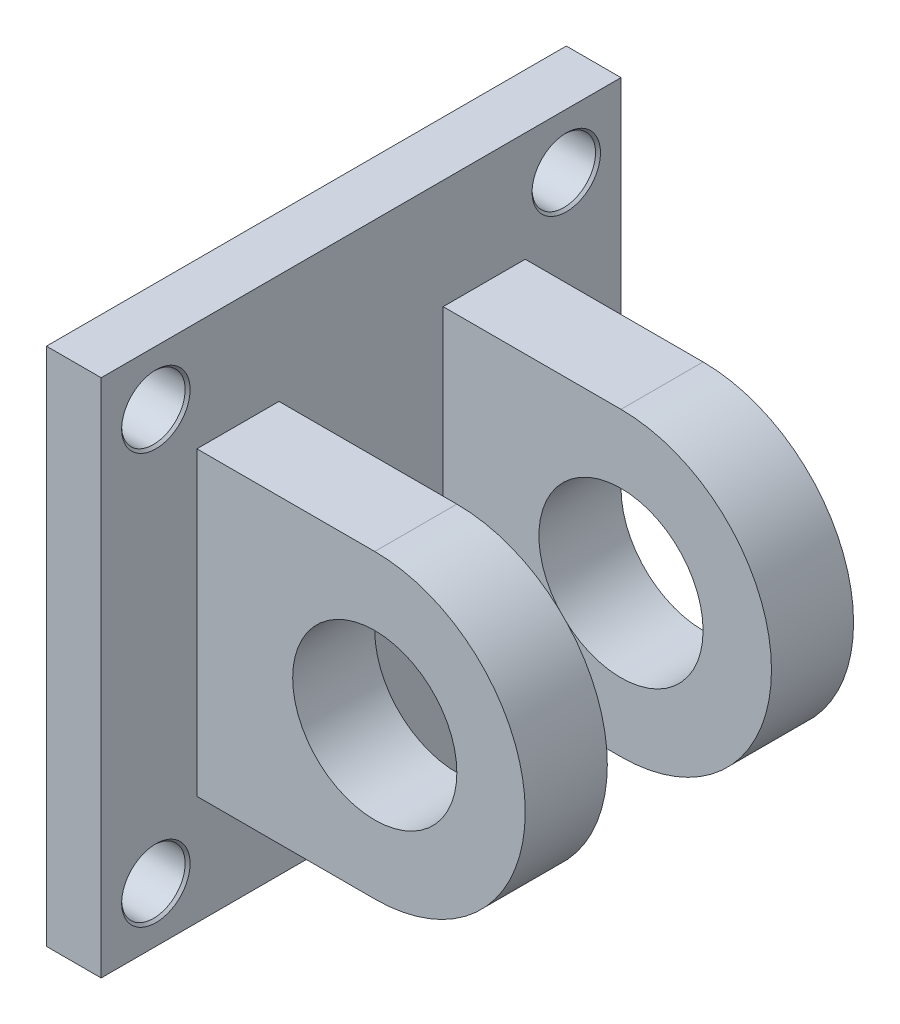
ISO-10303-21;
HEADER;
FILE_DESCRIPTION(('STEP AP214'),'2;1');
FILE_NAME('part.step','',(''),(''),'','','');
FILE_SCHEMA(('AUTOMOTIVE_DESIGN { 1 0 10303 214 1 1 1 1 }'));
ENDSEC;
DATA;
#1=APPLICATION_CONTEXT('core data for automotive mechanical design processes');
#2=APPLICATION_PROTOCOL_DEFINITION('international standard','automotive_design',2000,#1);
#3=PRODUCT_CONTEXT('',#1,'mechanical');
#4=PRODUCT('Part','Part','',(#3));
#5=PRODUCT_RELATED_PRODUCT_CATEGORY('part','',(#4));
#6=PRODUCT_DEFINITION_FORMATION('','',#4);
#7=PRODUCT_DEFINITION_CONTEXT('part definition',#1,'design');
#8=PRODUCT_DEFINITION('design','',#6,#7);
#9=PRODUCT_DEFINITION_SHAPE('','',#8);
#10=(LENGTH_UNIT() NAMED_UNIT(*) SI_UNIT(.MILLI.,.METRE.));
#11=(NAMED_UNIT(*) PLANE_ANGLE_UNIT() SI_UNIT($,.RADIAN.));
#12=(NAMED_UNIT(*) SI_UNIT($,.STERADIAN.) SOLID_ANGLE_UNIT());
#13=UNCERTAINTY_MEASURE_WITH_UNIT(LENGTH_MEASURE(1.E-05),#10,'distance_accuracy_value','');
#14=(GEOMETRIC_REPRESENTATION_CONTEXT(3) GLOBAL_UNCERTAINTY_ASSIGNED_CONTEXT((#13)) GLOBAL_UNIT_ASSIGNED_CONTEXT((#10,
#11,#12)) REPRESENTATION_CONTEXT('',''));
#15=CARTESIAN_POINT('',(0.,0.,0.));
#16=DIRECTION('',(0.,0.,1.));
#17=DIRECTION('',(1.,0.,0.));
#18=AXIS2_PLACEMENT_3D('',#15,#16,#17);
#19=CARTESIAN_POINT('',(25.4,0.,0.));
#20=DIRECTION('',(1.,0.,0.));
#21=DIRECTION('',(0.,0.,-1.));
#22=AXIS2_PLACEMENT_3D('',#19,#20,#21);
#23=PLANE('',#22);
#24=CARTESIAN_POINT('',(25.4,-95.25,95.25));
#25=DIRECTION('',(1.,0.,0.));
#26=DIRECTION('',(0.,0.,-1.));
#27=AXIS2_PLACEMENT_3D('',#24,#25,#26);
#28=CIRCLE('',#27,15.8749999999999);
#29=CARTESIAN_POINT('',(25.4,-95.25,79.3750000000001));
#30=VERTEX_POINT('',#29);
#31=EDGE_CURVE('E243',#30,#30,#28,.F.);
#32=ORIENTED_EDGE('',*,*,#31,.T.);
#33=EDGE_LOOP('',(#32));
#34=FACE_BOUND('',#33,.T.);
#35=CARTESIAN_POINT('',(25.4,-95.25,-95.25));
#36=DIRECTION('',(1.,0.,0.));
#37=DIRECTION('',(0.,0.,-1.));
#38=AXIS2_PLACEMENT_3D('',#35,#36,#37);
#39=CIRCLE('',#38,15.8749999999999);
#40=CARTESIAN_POINT('',(25.4,-95.25,-111.125));
#41=VERTEX_POINT('',#40);
#42=EDGE_CURVE('E240',#41,#41,#39,.F.);
#43=ORIENTED_EDGE('',*,*,#42,.T.);
#44=EDGE_LOOP('',(#43));
#45=FACE_BOUND('',#44,.T.);
#46=CARTESIAN_POINT('',(25.4,95.25,95.25));
#47=DIRECTION('',(1.,0.,0.));
#48=DIRECTION('',(0.,0.,-1.));
#49=AXIS2_PLACEMENT_3D('',#46,#47,#48);
#50=CIRCLE('',#49,15.875);
#51=CARTESIAN_POINT('',(25.4,95.25,79.375));
#52=VERTEX_POINT('',#51);
#53=EDGE_CURVE('E237',#52,#52,#50,.F.);
#54=ORIENTED_EDGE('',*,*,#53,.T.);
#55=EDGE_LOOP('',(#54));
#56=FACE_BOUND('',#55,.T.);
#57=CARTESIAN_POINT('',(25.4,95.25,-95.25));
#58=DIRECTION('',(1.,0.,0.));
#59=DIRECTION('',(0.,0.,-1.));
#60=AXIS2_PLACEMENT_3D('',#57,#58,#59);
#61=CIRCLE('',#60,15.875);
#62=CARTESIAN_POINT('',(25.4,95.25,-111.125));
#63=VERTEX_POINT('',#62);
#64=EDGE_CURVE('E234',#63,#63,#61,.F.);
#65=ORIENTED_EDGE('',*,*,#64,.T.);
#66=EDGE_LOOP('',(#65));
#67=FACE_BOUND('',#66,.T.);
#68=DIRECTION('',(0.,0.,1.));
#69=VECTOR('',#68,1.);
#70=CARTESIAN_POINT('',(25.4,120.65,-120.65));
#71=LINE('',#70,#69);
#72=CARTESIAN_POINT('',(25.4,120.65,-120.65));
#73=VERTEX_POINT('',#72);
#74=CARTESIAN_POINT('',(25.4,120.65,120.65));
#75=VERTEX_POINT('',#74);
#76=EDGE_CURVE('E183',#73,#75,#71,.T.);
#77=ORIENTED_EDGE('',*,*,#76,.T.);
#78=DIRECTION('',(0.,-1.,0.));
#79=VECTOR('',#78,1.);
#80=CARTESIAN_POINT('',(25.4,120.65,120.65));
#81=LINE('',#80,#79);
#82=CARTESIAN_POINT('',(25.4,-120.65,120.65));
#83=VERTEX_POINT('',#82);
#84=EDGE_CURVE('E206',#75,#83,#81,.T.);
#85=ORIENTED_EDGE('',*,*,#84,.T.);
#86=DIRECTION('',(0.,0.,-1.));
#87=VECTOR('',#86,1.);
#88=CARTESIAN_POINT('',(25.4,-120.65,120.65));
#89=LINE('',#88,#87);
#90=CARTESIAN_POINT('',(25.4,-120.65,-120.65));
#91=VERTEX_POINT('',#90);
#92=EDGE_CURVE('E209',#83,#91,#89,.T.);
#93=ORIENTED_EDGE('',*,*,#92,.T.);
#94=DIRECTION('',(0.,1.,0.));
#95=VECTOR('',#94,1.);
#96=CARTESIAN_POINT('',(25.4,-120.65,-120.65));
#97=LINE('',#96,#95);
#98=EDGE_CURVE('E194',#91,#73,#97,.T.);
#99=ORIENTED_EDGE('',*,*,#98,.T.);
#100=EDGE_LOOP('',(#77,#85,#93,#99));
#101=FACE_BOUND('',#100,.T.);
#102=DIRECTION('',(0.,0.,-1.));
#103=VECTOR('',#102,1.);
#104=CARTESIAN_POINT('',(25.4,-69.85,-38.1));
#105=LINE('',#104,#103);
#106=CARTESIAN_POINT('',(25.4,-69.85,-38.1));
#107=VERTEX_POINT('',#106);
#108=CARTESIAN_POINT('',(25.4,-69.85,-76.2));
#109=VERTEX_POINT('',#108);
#110=EDGE_CURVE('E170',#107,#109,#105,.T.);
#111=ORIENTED_EDGE('',*,*,#110,.F.);
#112=DIRECTION('',(0.,1.,0.));
#113=VECTOR('',#112,1.);
#114=CARTESIAN_POINT('',(25.4,-69.85,-38.1));
#115=LINE('',#114,#113);
#116=CARTESIAN_POINT('',(25.4,69.85,-38.1));
#117=VERTEX_POINT('',#116);
#118=EDGE_CURVE('E161',#107,#117,#115,.T.);
#119=ORIENTED_EDGE('',*,*,#118,.T.);
#120=DIRECTION('',(0.,0.,-1.));
#121=VECTOR('',#120,1.);
#122=CARTESIAN_POINT('',(25.4,69.85,-38.1));
#123=LINE('',#122,#121);
#124=CARTESIAN_POINT('',(25.4,69.85,-76.2));
#125=VERTEX_POINT('',#124);
#126=EDGE_CURVE('E186',#117,#125,#123,.T.);
#127=ORIENTED_EDGE('',*,*,#126,.T.);
#128=DIRECTION('',(0.,1.,0.));
#129=VECTOR('',#128,1.);
#130=CARTESIAN_POINT('',(25.4,-69.85,-76.2));
#131=LINE('',#130,#129);
#132=EDGE_CURVE('E173',#109,#125,#131,.T.);
#133=ORIENTED_EDGE('',*,*,#132,.F.);
#134=EDGE_LOOP('',(#111,#119,#127,#133));
#135=FACE_BOUND('',#134,.T.);
#136=DIRECTION('',(0.,0.,1.));
#137=VECTOR('',#136,1.);
#138=CARTESIAN_POINT('',(25.4,69.85,38.1));
#139=LINE('',#138,#137);
#140=CARTESIAN_POINT('',(25.4,69.85,38.1));
#141=VERTEX_POINT('',#140);
#142=CARTESIAN_POINT('',(25.4,69.85,76.2));
#143=VERTEX_POINT('',#142);
#144=EDGE_CURVE('E47',#141,#143,#139,.T.);
#145=ORIENTED_EDGE('',*,*,#144,.F.);
#146=DIRECTION('',(0.,-1.,0.));
#147=VECTOR('',#146,1.);
#148=CARTESIAN_POINT('',(25.4,69.85,38.1));
#149=LINE('',#148,#147);
#150=CARTESIAN_POINT('',(25.4,-69.85,38.1));
#151=VERTEX_POINT('',#150);
#152=EDGE_CURVE('E51',#141,#151,#149,.T.);
#153=ORIENTED_EDGE('',*,*,#152,.T.);
#154=DIRECTION('',(0.,0.,1.));
#155=VECTOR('',#154,1.);
#156=CARTESIAN_POINT('',(25.4,-69.85,38.1));
#157=LINE('',#156,#155);
#158=CARTESIAN_POINT('',(25.4,-69.85,76.2));
#159=VERTEX_POINT('',#158);
#160=EDGE_CURVE('E130',#151,#159,#157,.T.);
#161=ORIENTED_EDGE('',*,*,#160,.T.);
#162=DIRECTION('',(0.,-1.,0.));
#163=VECTOR('',#162,1.);
#164=CARTESIAN_POINT('',(25.4,69.85,76.2));
#165=LINE('',#164,#163);
#166=EDGE_CURVE('E148',#143,#159,#165,.T.);
#167=ORIENTED_EDGE('',*,*,#166,.F.);
#168=EDGE_LOOP('',(#145,#153,#161,#167));
#169=FACE_BOUND('',#168,.T.);
#170=ADVANCED_FACE('F32',(#34,#45,#56,#67,#101,#135,#169),#23,.T.);
#171=CARTESIAN_POINT('',(0.,120.65,-120.65));
#172=DIRECTION('',(0.,1.,0.));
#173=DIRECTION('',(0.,0.,1.));
#174=AXIS2_PLACEMENT_3D('',#171,#172,#173);
#175=PLANE('',#174);
#176=ORIENTED_EDGE('',*,*,#76,.F.);
#177=DIRECTION('',(1.,0.,0.));
#178=VECTOR('',#177,1.);
#179=CARTESIAN_POINT('',(0.,120.65,-120.65));
#180=LINE('',#179,#178);
#181=CARTESIAN_POINT('',(0.,120.65,-120.65));
#182=VERTEX_POINT('',#181);
#183=EDGE_CURVE('E214',#182,#73,#180,.T.);
#184=ORIENTED_EDGE('',*,*,#183,.F.);
#185=DIRECTION('',(0.,0.,1.));
#186=VECTOR('',#185,1.);
#187=CARTESIAN_POINT('',(0.,120.65,-120.65));
#188=LINE('',#187,#186);
#189=CARTESIAN_POINT('',(0.,120.65,120.65));
#190=VERTEX_POINT('',#189);
#191=EDGE_CURVE('E190',#182,#190,#188,.T.);
#192=ORIENTED_EDGE('',*,*,#191,.T.);
#193=DIRECTION('',(1.,0.,0.));
#194=VECTOR('',#193,1.);
#195=CARTESIAN_POINT('',(0.,120.65,120.65));
#196=LINE('',#195,#194);
#197=EDGE_CURVE('E203',#190,#75,#196,.T.);
#198=ORIENTED_EDGE('',*,*,#197,.T.);
#199=EDGE_LOOP('',(#176,#184,#192,#198));
#200=FACE_BOUND('',#199,.T.);
#201=ADVANCED_FACE('F284',(#200),#175,.T.);
#202=CARTESIAN_POINT('',(0.,-120.65,-120.65));
#203=DIRECTION('',(0.,0.,-1.));
#204=DIRECTION('',(-1.,0.,0.));
#205=AXIS2_PLACEMENT_3D('',#202,#203,#204);
#206=PLANE('',#205);
#207=ORIENTED_EDGE('',*,*,#98,.F.);
#208=DIRECTION('',(1.,0.,0.));
#209=VECTOR('',#208,1.);
#210=CARTESIAN_POINT('',(0.,-120.65,-120.65));
#211=LINE('',#210,#209);
#212=CARTESIAN_POINT('',(0.,-120.65,-120.65));
#213=VERTEX_POINT('',#212);
#214=EDGE_CURVE('E217',#213,#91,#211,.T.);
#215=ORIENTED_EDGE('',*,*,#214,.F.);
#216=DIRECTION('',(0.,1.,0.));
#217=VECTOR('',#216,1.);
#218=CARTESIAN_POINT('',(0.,-120.65,-120.65));
#219=LINE('',#218,#217);
#220=EDGE_CURVE('E200',#213,#182,#219,.T.);
#221=ORIENTED_EDGE('',*,*,#220,.T.);
#222=ORIENTED_EDGE('',*,*,#183,.T.);
#223=EDGE_LOOP('',(#207,#215,#221,#222));
#224=FACE_BOUND('',#223,.T.);
#225=ADVANCED_FACE('F290',(#224),#206,.T.);
#226=CARTESIAN_POINT('',(0.,-120.65,120.65));
#227=DIRECTION('',(0.,-1.,0.));
#228=DIRECTION('',(0.,0.,-1.));
#229=AXIS2_PLACEMENT_3D('',#226,#227,#228);
#230=PLANE('',#229);
#231=ORIENTED_EDGE('',*,*,#92,.F.);
#232=DIRECTION('',(1.,0.,0.));
#233=VECTOR('',#232,1.);
#234=CARTESIAN_POINT('',(0.,-120.65,120.65));
#235=LINE('',#234,#233);
#236=CARTESIAN_POINT('',(0.,-120.65,120.65));
#237=VERTEX_POINT('',#236);
#238=EDGE_CURVE('E219',#237,#83,#235,.T.);
#239=ORIENTED_EDGE('',*,*,#238,.F.);
#240=DIRECTION('',(0.,0.,-1.));
#241=VECTOR('',#240,1.);
#242=CARTESIAN_POINT('',(0.,-120.65,120.65));
#243=LINE('',#242,#241);
#244=EDGE_CURVE('E197',#237,#213,#243,.T.);
#245=ORIENTED_EDGE('',*,*,#244,.T.);
#246=ORIENTED_EDGE('',*,*,#214,.T.);
#247=EDGE_LOOP('',(#231,#239,#245,#246));
#248=FACE_BOUND('',#247,.T.);
#249=ADVANCED_FACE('F300',(#248),#230,.T.);
#250=CARTESIAN_POINT('',(0.,120.65,120.65));
#251=DIRECTION('',(0.,0.,1.));
#252=DIRECTION('',(1.,0.,0.));
#253=AXIS2_PLACEMENT_3D('',#250,#251,#252);
#254=PLANE('',#253);
#255=ORIENTED_EDGE('',*,*,#84,.F.);
#256=ORIENTED_EDGE('',*,*,#197,.F.);
#257=DIRECTION('',(0.,-1.,0.));
#258=VECTOR('',#257,1.);
#259=CARTESIAN_POINT('',(0.,120.65,120.65));
#260=LINE('',#259,#258);
#261=EDGE_CURVE('E193',#190,#237,#260,.T.);
#262=ORIENTED_EDGE('',*,*,#261,.T.);
#263=ORIENTED_EDGE('',*,*,#238,.T.);
#264=EDGE_LOOP('',(#255,#256,#262,#263));
#265=FACE_BOUND('',#264,.T.);
#266=ADVANCED_FACE('F304',(#265),#254,.T.);
#267=CARTESIAN_POINT('',(0.,0.,0.));
#268=DIRECTION('',(1.,0.,0.));
#269=DIRECTION('',(0.,0.,-1.));
#270=AXIS2_PLACEMENT_3D('',#267,#268,#269);
#271=PLANE('',#270);
#272=CARTESIAN_POINT('',(0.,-95.25,-95.25));
#273=DIRECTION('',(1.,0.,0.));
#274=DIRECTION('',(0.,0.,-1.));
#275=AXIS2_PLACEMENT_3D('',#272,#273,#274);
#276=CIRCLE('',#275,15.875);
#277=CARTESIAN_POINT('',(0.,-95.25,-111.125));
#278=VERTEX_POINT('',#277);
#279=EDGE_CURVE('E261',#278,#278,#276,.T.);
#280=ORIENTED_EDGE('',*,*,#279,.T.);
#281=EDGE_LOOP('',(#280));
#282=FACE_BOUND('',#281,.T.);
#283=CARTESIAN_POINT('',(0.,95.25,95.25));
#284=DIRECTION('',(1.,0.,0.));
#285=DIRECTION('',(0.,0.,-1.));
#286=AXIS2_PLACEMENT_3D('',#283,#284,#285);
#287=CIRCLE('',#286,15.875);
#288=CARTESIAN_POINT('',(0.,95.25,79.375));
#289=VERTEX_POINT('',#288);
#290=EDGE_CURVE('E258',#289,#289,#287,.T.);
#291=ORIENTED_EDGE('',*,*,#290,.T.);
#292=EDGE_LOOP('',(#291));
#293=FACE_BOUND('',#292,.T.);
#294=CARTESIAN_POINT('',(0.,-95.25,95.25));
#295=DIRECTION('',(1.,0.,0.));
#296=DIRECTION('',(0.,0.,-1.));
#297=AXIS2_PLACEMENT_3D('',#294,#295,#296);
#298=CIRCLE('',#297,15.875);
#299=CARTESIAN_POINT('',(0.,-95.25,79.375));
#300=VERTEX_POINT('',#299);
#301=EDGE_CURVE('E255',#300,#300,#298,.T.);
#302=ORIENTED_EDGE('',*,*,#301,.T.);
#303=EDGE_LOOP('',(#302));
#304=FACE_BOUND('',#303,.T.);
#305=CARTESIAN_POINT('',(0.,95.25,-95.25));
#306=DIRECTION('',(1.,0.,0.));
#307=DIRECTION('',(0.,0.,-1.));
#308=AXIS2_PLACEMENT_3D('',#305,#306,#307);
#309=CIRCLE('',#308,15.875);
#310=CARTESIAN_POINT('',(0.,95.25,-111.125));
#311=VERTEX_POINT('',#310);
#312=EDGE_CURVE('E252',#311,#311,#309,.T.);
#313=ORIENTED_EDGE('',*,*,#312,.T.);
#314=EDGE_LOOP('',(#313));
#315=FACE_BOUND('',#314,.T.);
#316=ORIENTED_EDGE('',*,*,#191,.F.);
#317=ORIENTED_EDGE('',*,*,#220,.F.);
#318=ORIENTED_EDGE('',*,*,#244,.F.);
#319=ORIENTED_EDGE('',*,*,#261,.F.);
#320=EDGE_LOOP('',(#316,#317,#318,#319));
#321=FACE_BOUND('',#320,.T.);
#322=ADVANCED_FACE('F296',(#282,#293,#304,#315,#321),#271,.F.);
#323=CARTESIAN_POINT('',(107.95,-69.85,-38.1));
#324=DIRECTION('',(0.,-1.,0.));
#325=DIRECTION('',(0.,0.,-1.));
#326=AXIS2_PLACEMENT_3D('',#323,#324,#325);
#327=PLANE('',#326);
#328=DIRECTION('',(-1.,0.,0.));
#329=VECTOR('',#328,1.);
#330=CARTESIAN_POINT('',(107.95,-69.85,-76.2));
#331=LINE('',#330,#329);
#332=CARTESIAN_POINT('',(107.95,-69.85,-76.2));
#333=VERTEX_POINT('',#332);
#334=EDGE_CURVE('E155',#333,#109,#331,.T.);
#335=ORIENTED_EDGE('',*,*,#334,.F.);
#336=DIRECTION('',(0.,0.,-1.));
#337=VECTOR('',#336,1.);
#338=CARTESIAN_POINT('',(107.95,-69.85,-38.1));
#339=LINE('',#338,#337);
#340=CARTESIAN_POINT('',(107.95,-69.85,-38.1));
#341=VERTEX_POINT('',#340);
#342=EDGE_CURVE('E181',#341,#333,#339,.T.);
#343=ORIENTED_EDGE('',*,*,#342,.F.);
#344=DIRECTION('',(-1.,0.,0.));
#345=VECTOR('',#344,1.);
#346=CARTESIAN_POINT('',(107.95,-69.85,-38.1));
#347=LINE('',#346,#345);
#348=EDGE_CURVE('E158',#341,#107,#347,.T.);
#349=ORIENTED_EDGE('',*,*,#348,.T.);
#350=ORIENTED_EDGE('',*,*,#110,.T.);
#351=EDGE_LOOP('',(#335,#343,#349,#350));
#352=FACE_BOUND('',#351,.T.);
#353=ADVANCED_FACE('F340',(#352),#327,.T.);
#354=CARTESIAN_POINT('',(107.95,0.,-38.1));
#355=DIRECTION('',(0.,0.,-1.));
#356=DIRECTION('',(-1.,0.,0.));
#357=AXIS2_PLACEMENT_3D('',#354,#355,#356);
#358=CYLINDRICAL_SURFACE('',#357,69.85);
#359=CARTESIAN_POINT('',(107.95,0.,-76.2));
#360=DIRECTION('',(0.,0.,-1.));
#361=DIRECTION('',(-1.,0.,0.));
#362=AXIS2_PLACEMENT_3D('',#359,#360,#361);
#363=CIRCLE('',#362,69.85);
#364=CARTESIAN_POINT('',(107.95,69.85,-76.2));
#365=VERTEX_POINT('',#364);
#366=EDGE_CURVE('E162',#365,#333,#363,.T.);
#367=ORIENTED_EDGE('',*,*,#366,.F.);
#368=DIRECTION('',(0.,0.,-1.));
#369=VECTOR('',#368,1.);
#370=CARTESIAN_POINT('',(107.95,69.85,-38.1));
#371=LINE('',#370,#369);
#372=CARTESIAN_POINT('',(107.95,69.85,-38.1));
#373=VERTEX_POINT('',#372);
#374=EDGE_CURVE('E184',#373,#365,#371,.T.);
#375=ORIENTED_EDGE('',*,*,#374,.F.);
#376=CARTESIAN_POINT('',(107.95,0.,-38.1));
#377=DIRECTION('',(0.,0.,-1.));
#378=DIRECTION('',(-1.,0.,0.));
#379=AXIS2_PLACEMENT_3D('',#376,#377,#378);
#380=CIRCLE('',#379,69.85);
#381=EDGE_CURVE('E167',#373,#341,#380,.T.);
#382=ORIENTED_EDGE('',*,*,#381,.T.);
#383=ORIENTED_EDGE('',*,*,#342,.T.);
#384=EDGE_LOOP('',(#367,#375,#382,#383));
#385=FACE_BOUND('',#384,.T.);
#386=ADVANCED_FACE('F363',(#385),#358,.T.);
#387=CARTESIAN_POINT('',(25.4,69.85,-38.1));
#388=DIRECTION('',(0.,1.,0.));
#389=DIRECTION('',(0.,0.,1.));
#390=AXIS2_PLACEMENT_3D('',#387,#388,#389);
#391=PLANE('',#390);
#392=DIRECTION('',(1.,0.,0.));
#393=VECTOR('',#392,1.);
#394=CARTESIAN_POINT('',(25.4,69.85,-76.2));
#395=LINE('',#394,#393);
#396=EDGE_CURVE('E176',#125,#365,#395,.T.);
#397=ORIENTED_EDGE('',*,*,#396,.F.);
#398=ORIENTED_EDGE('',*,*,#126,.F.);
#399=DIRECTION('',(1.,0.,0.));
#400=VECTOR('',#399,1.);
#401=CARTESIAN_POINT('',(25.4,69.85,-38.1));
#402=LINE('',#401,#400);
#403=EDGE_CURVE('E164',#117,#373,#402,.T.);
#404=ORIENTED_EDGE('',*,*,#403,.T.);
#405=ORIENTED_EDGE('',*,*,#374,.T.);
#406=EDGE_LOOP('',(#397,#398,#404,#405));
#407=FACE_BOUND('',#406,.T.);
#408=ADVANCED_FACE('F366',(#407),#391,.T.);
#409=CARTESIAN_POINT('',(107.95,0.,-38.1));
#410=DIRECTION('',(0.,0.,-1.));
#411=DIRECTION('',(-1.,0.,0.));
#412=AXIS2_PLACEMENT_3D('',#409,#410,#411);
#413=PLANE('',#412);
#414=CARTESIAN_POINT('',(107.95,0.,-38.1));
#415=DIRECTION('',(0.,0.,1.));
#416=DIRECTION('',(1.,0.,0.));
#417=AXIS2_PLACEMENT_3D('',#414,#415,#416);
#418=CIRCLE('',#417,38.1);
#419=CARTESIAN_POINT('',(146.05,0.,-38.1));
#420=VERTEX_POINT('',#419);
#421=EDGE_CURVE('E228',#420,#420,#418,.T.);
#422=ORIENTED_EDGE('',*,*,#421,.F.);
#423=EDGE_LOOP('',(#422));
#424=FACE_BOUND('',#423,.T.);
#425=ORIENTED_EDGE('',*,*,#348,.F.);
#426=ORIENTED_EDGE('',*,*,#381,.F.);
#427=ORIENTED_EDGE('',*,*,#403,.F.);
#428=ORIENTED_EDGE('',*,*,#118,.F.);
#429=EDGE_LOOP('',(#425,#426,#427,#428));
#430=FACE_BOUND('',#429,.T.);
#431=ADVANCED_FACE('F359',(#424,#430),#413,.F.);
#432=CARTESIAN_POINT('',(107.95,0.,-76.2));
#433=DIRECTION('',(0.,0.,-1.));
#434=DIRECTION('',(-1.,0.,0.));
#435=AXIS2_PLACEMENT_3D('',#432,#433,#434);
#436=PLANE('',#435);
#437=CARTESIAN_POINT('',(107.95,0.,-76.2));
#438=DIRECTION('',(0.,0.,-1.));
#439=DIRECTION('',(-1.,0.,0.));
#440=AXIS2_PLACEMENT_3D('',#437,#438,#439);
#441=CIRCLE('',#440,38.1);
#442=CARTESIAN_POINT('',(69.85,0.,-76.2));
#443=VERTEX_POINT('',#442);
#444=EDGE_CURVE('E225',#443,#443,#441,.T.);
#445=ORIENTED_EDGE('',*,*,#444,.F.);
#446=EDGE_LOOP('',(#445));
#447=FACE_BOUND('',#446,.T.);
#448=ORIENTED_EDGE('',*,*,#334,.T.);
#449=ORIENTED_EDGE('',*,*,#132,.T.);
#450=ORIENTED_EDGE('',*,*,#396,.T.);
#451=ORIENTED_EDGE('',*,*,#366,.T.);
#452=EDGE_LOOP('',(#448,#449,#450,#451));
#453=FACE_BOUND('',#452,.T.);
#454=ADVANCED_FACE('F368',(#447,#453),#436,.T.);
#455=CARTESIAN_POINT('',(107.95,69.85,38.1));
#456=DIRECTION('',(0.,1.,0.));
#457=DIRECTION('',(0.,0.,1.));
#458=AXIS2_PLACEMENT_3D('',#455,#456,#457);
#459=PLANE('',#458);
#460=DIRECTION('',(-1.,0.,0.));
#461=VECTOR('',#460,1.);
#462=CARTESIAN_POINT('',(107.95,69.85,76.2));
#463=LINE('',#462,#461);
#464=CARTESIAN_POINT('',(107.95,69.85,76.2));
#465=VERTEX_POINT('',#464);
#466=EDGE_CURVE('E145',#465,#143,#463,.T.);
#467=ORIENTED_EDGE('',*,*,#466,.F.);
#468=DIRECTION('',(0.,0.,1.));
#469=VECTOR('',#468,1.);
#470=CARTESIAN_POINT('',(107.95,69.85,38.1));
#471=LINE('',#470,#469);
#472=CARTESIAN_POINT('',(107.95,69.85,38.1));
#473=VERTEX_POINT('',#472);
#474=EDGE_CURVE('E129',#473,#465,#471,.T.);
#475=ORIENTED_EDGE('',*,*,#474,.F.);
#476=DIRECTION('',(-1.,0.,0.));
#477=VECTOR('',#476,1.);
#478=CARTESIAN_POINT('',(107.95,69.85,38.1));
#479=LINE('',#478,#477);
#480=EDGE_CURVE('E140',#473,#141,#479,.T.);
#481=ORIENTED_EDGE('',*,*,#480,.T.);
#482=ORIENTED_EDGE('',*,*,#144,.T.);
#483=EDGE_LOOP('',(#467,#475,#481,#482));
#484=FACE_BOUND('',#483,.T.);
#485=ADVANCED_FACE('F370',(#484),#459,.T.);
#486=CARTESIAN_POINT('',(107.95,0.,38.1));
#487=DIRECTION('',(0.,0.,1.));
#488=DIRECTION('',(1.,0.,0.));
#489=AXIS2_PLACEMENT_3D('',#486,#487,#488);
#490=CYLINDRICAL_SURFACE('',#489,69.85);
#491=CARTESIAN_POINT('',(107.95,0.,76.2));
#492=DIRECTION('',(0.,0.,1.));
#493=DIRECTION('',(1.,0.,0.));
#494=AXIS2_PLACEMENT_3D('',#491,#492,#493);
#495=CIRCLE('',#494,69.85);
#496=CARTESIAN_POINT('',(107.95,-69.85,76.2));
#497=VERTEX_POINT('',#496);
#498=EDGE_CURVE('E125',#497,#465,#495,.T.);
#499=ORIENTED_EDGE('',*,*,#498,.F.);
#500=DIRECTION('',(0.,0.,1.));
#501=VECTOR('',#500,1.);
#502=CARTESIAN_POINT('',(107.95,-69.85,38.1));
#503=LINE('',#502,#501);
#504=CARTESIAN_POINT('',(107.95,-69.85,38.1));
#505=VERTEX_POINT('',#504);
#506=EDGE_CURVE('E119',#505,#497,#503,.T.);
#507=ORIENTED_EDGE('',*,*,#506,.F.);
#508=CARTESIAN_POINT('',(107.95,0.,38.1));
#509=DIRECTION('',(0.,0.,1.));
#510=DIRECTION('',(1.,0.,0.));
#511=AXIS2_PLACEMENT_3D('',#508,#509,#510);
#512=CIRCLE('',#511,69.85);
#513=EDGE_CURVE('E123',#505,#473,#512,.T.);
#514=ORIENTED_EDGE('',*,*,#513,.T.);
#515=ORIENTED_EDGE('',*,*,#474,.T.);
#516=EDGE_LOOP('',(#499,#507,#514,#515));
#517=FACE_BOUND('',#516,.T.);
#518=ADVANCED_FACE('F121',(#517),#490,.T.);
#519=CARTESIAN_POINT('',(25.4,-69.85,38.1));
#520=DIRECTION('',(0.,-1.,0.));
#521=DIRECTION('',(0.,0.,-1.));
#522=AXIS2_PLACEMENT_3D('',#519,#520,#521);
#523=PLANE('',#522);
#524=DIRECTION('',(1.,0.,0.));
#525=VECTOR('',#524,1.);
#526=CARTESIAN_POINT('',(25.4,-69.85,76.2));
#527=LINE('',#526,#525);
#528=EDGE_CURVE('E152',#159,#497,#527,.T.);
#529=ORIENTED_EDGE('',*,*,#528,.F.);
#530=ORIENTED_EDGE('',*,*,#160,.F.);
#531=DIRECTION('',(1.,0.,0.));
#532=VECTOR('',#531,1.);
#533=CARTESIAN_POINT('',(25.4,-69.85,38.1));
#534=LINE('',#533,#532);
#535=EDGE_CURVE('E133',#151,#505,#534,.T.);
#536=ORIENTED_EDGE('',*,*,#535,.T.);
#537=ORIENTED_EDGE('',*,*,#506,.T.);
#538=EDGE_LOOP('',(#529,#530,#536,#537));
#539=FACE_BOUND('',#538,.T.);
#540=ADVANCED_FACE('F134',(#539),#523,.T.);
#541=CARTESIAN_POINT('',(107.95,0.,38.1));
#542=DIRECTION('',(0.,0.,1.));
#543=DIRECTION('',(1.,0.,0.));
#544=AXIS2_PLACEMENT_3D('',#541,#542,#543);
#545=PLANE('',#544);
#546=CARTESIAN_POINT('',(107.95,0.,38.1));
#547=DIRECTION('',(0.,0.,-1.));
#548=DIRECTION('',(-1.,0.,0.));
#549=AXIS2_PLACEMENT_3D('',#546,#547,#548);
#550=CIRCLE('',#549,38.1);
#551=CARTESIAN_POINT('',(69.85,0.,38.1));
#552=VERTEX_POINT('',#551);
#553=EDGE_CURVE('E224',#552,#552,#550,.T.);
#554=ORIENTED_EDGE('',*,*,#553,.F.);
#555=EDGE_LOOP('',(#554));
#556=FACE_BOUND('',#555,.T.);
#557=ORIENTED_EDGE('',*,*,#480,.F.);
#558=ORIENTED_EDGE('',*,*,#513,.F.);
#559=ORIENTED_EDGE('',*,*,#535,.F.);
#560=ORIENTED_EDGE('',*,*,#152,.F.);
#561=EDGE_LOOP('',(#557,#558,#559,#560));
#562=FACE_BOUND('',#561,.T.);
#563=ADVANCED_FACE('F138',(#556,#562),#545,.F.);
#564=CARTESIAN_POINT('',(107.95,0.,76.2));
#565=DIRECTION('',(0.,0.,1.));
#566=DIRECTION('',(1.,0.,0.));
#567=AXIS2_PLACEMENT_3D('',#564,#565,#566);
#568=PLANE('',#567);
#569=CARTESIAN_POINT('',(107.95,0.,76.2));
#570=DIRECTION('',(0.,0.,1.));
#571=DIRECTION('',(1.,0.,0.));
#572=AXIS2_PLACEMENT_3D('',#569,#570,#571);
#573=CIRCLE('',#572,38.1);
#574=CARTESIAN_POINT('',(146.05,0.,76.2));
#575=VERTEX_POINT('',#574);
#576=EDGE_CURVE('E149',#575,#575,#573,.T.);
#577=ORIENTED_EDGE('',*,*,#576,.F.);
#578=EDGE_LOOP('',(#577));
#579=FACE_BOUND('',#578,.T.);
#580=ORIENTED_EDGE('',*,*,#466,.T.);
#581=ORIENTED_EDGE('',*,*,#166,.T.);
#582=ORIENTED_EDGE('',*,*,#528,.T.);
#583=ORIENTED_EDGE('',*,*,#498,.T.);
#584=EDGE_LOOP('',(#580,#581,#582,#583));
#585=FACE_BOUND('',#584,.T.);
#586=ADVANCED_FACE('F446',(#579,#585),#568,.T.);
#587=CARTESIAN_POINT('',(0.,-95.25,95.25));
#588=DIRECTION('',(-1.,0.,0.));
#589=DIRECTION('',(0.,0.,1.));
#590=AXIS2_PLACEMENT_3D('',#587,#588,#589);
#591=CYLINDRICAL_SURFACE('',#590,14.72946);
#592=CARTESIAN_POINT('',(24.2544600000001,-95.25,95.25));
#593=DIRECTION('',(1.,0.,0.));
#594=DIRECTION('',(0.,0.,-1.));
#595=AXIS2_PLACEMENT_3D('',#592,#593,#594);
#596=CIRCLE('',#595,14.72946);
#597=CARTESIAN_POINT('',(24.2544600000001,-95.25,80.52054));
#598=VERTEX_POINT('',#597);
#599=EDGE_CURVE('E231',#598,#598,#596,.T.);
#600=ORIENTED_EDGE('',*,*,#599,.T.);
#601=EDGE_LOOP('',(#600));
#602=FACE_BOUND('',#601,.T.);
#603=CARTESIAN_POINT('',(1.14553999999998,-95.25,95.25));
#604=DIRECTION('',(1.,0.,0.));
#605=DIRECTION('',(0.,0.,-1.));
#606=AXIS2_PLACEMENT_3D('',#603,#604,#605);
#607=CIRCLE('',#606,14.72946);
#608=CARTESIAN_POINT('',(1.14553999999998,-95.25,80.52054));
#609=VERTEX_POINT('',#608);
#610=EDGE_CURVE('E216',#609,#609,#607,.F.);
#611=ORIENTED_EDGE('',*,*,#610,.T.);
#612=EDGE_LOOP('',(#611));
#613=FACE_BOUND('',#612,.T.);
#614=ADVANCED_FACE('F440',(#602,#613),#591,.F.);
#615=CARTESIAN_POINT('',(0.,-95.25,-95.25));
#616=DIRECTION('',(-1.,0.,0.));
#617=DIRECTION('',(0.,0.,1.));
#618=AXIS2_PLACEMENT_3D('',#615,#616,#617);
#619=CYLINDRICAL_SURFACE('',#618,14.72946);
#620=CARTESIAN_POINT('',(24.2544600000001,-95.25,-95.25));
#621=DIRECTION('',(1.,0.,0.));
#622=DIRECTION('',(0.,0.,-1.));
#623=AXIS2_PLACEMENT_3D('',#620,#621,#622);
#624=CIRCLE('',#623,14.72946);
#625=CARTESIAN_POINT('',(24.2544600000001,-95.25,-109.97946));
#626=VERTEX_POINT('',#625);
#627=EDGE_CURVE('E249',#626,#626,#624,.T.);
#628=ORIENTED_EDGE('',*,*,#627,.T.);
#629=EDGE_LOOP('',(#628));
#630=FACE_BOUND('',#629,.T.);
#631=CARTESIAN_POINT('',(1.14553999999998,-95.25,-95.25));
#632=DIRECTION('',(1.,0.,0.));
#633=DIRECTION('',(0.,0.,-1.));
#634=AXIS2_PLACEMENT_3D('',#631,#632,#633);
#635=CIRCLE('',#634,14.72946);
#636=CARTESIAN_POINT('',(1.14553999999998,-95.25,-109.97946));
#637=VERTEX_POINT('',#636);
#638=EDGE_CURVE('E246',#637,#637,#635,.F.);
#639=ORIENTED_EDGE('',*,*,#638,.T.);
#640=EDGE_LOOP('',(#639));
#641=FACE_BOUND('',#640,.T.);
#642=ADVANCED_FACE('F445',(#630,#641),#619,.F.);
#643=CARTESIAN_POINT('',(25.4,95.25,-95.25));
#644=DIRECTION('',(1.,0.,0.));
#645=DIRECTION('',(0.,0.,-1.));
#646=AXIS2_PLACEMENT_3D('',#643,#644,#645);
#647=CYLINDRICAL_SURFACE('',#646,14.72946);
#648=CARTESIAN_POINT('',(1.14553999999999,95.25,-95.25));
#649=DIRECTION('',(1.,0.,0.));
#650=DIRECTION('',(0.,0.,-1.));
#651=AXIS2_PLACEMENT_3D('',#648,#649,#650);
#652=CIRCLE('',#651,14.72946);
#653=CARTESIAN_POINT('',(1.14553999999999,95.25,-109.97946));
#654=VERTEX_POINT('',#653);
#655=EDGE_CURVE('E11',#654,#654,#652,.F.);
#656=ORIENTED_EDGE('',*,*,#655,.T.);
#657=EDGE_LOOP('',(#656));
#658=FACE_BOUND('',#657,.T.);
#659=CARTESIAN_POINT('',(24.25446,95.25,-95.25));
#660=DIRECTION('',(1.,0.,0.));
#661=DIRECTION('',(0.,0.,-1.));
#662=AXIS2_PLACEMENT_3D('',#659,#660,#661);
#663=CIRCLE('',#662,14.72946);
#664=CARTESIAN_POINT('',(24.25446,95.25,-109.97946));
#665=VERTEX_POINT('',#664);
#666=EDGE_CURVE('E40',#665,#665,#663,.T.);
#667=ORIENTED_EDGE('',*,*,#666,.T.);
#668=EDGE_LOOP('',(#667));
#669=FACE_BOUND('',#668,.T.);
#670=ADVANCED_FACE('F272',(#658,#669),#647,.F.);
#671=CARTESIAN_POINT('',(25.4,95.25,95.25));
#672=DIRECTION('',(1.,0.,0.));
#673=DIRECTION('',(0.,0.,-1.));
#674=AXIS2_PLACEMENT_3D('',#671,#672,#673);
#675=CYLINDRICAL_SURFACE('',#674,14.72946);
#676=CARTESIAN_POINT('',(1.14553999999999,95.25,95.25));
#677=DIRECTION('',(1.,0.,0.));
#678=DIRECTION('',(0.,0.,-1.));
#679=AXIS2_PLACEMENT_3D('',#676,#677,#678);
#680=CIRCLE('',#679,14.72946);
#681=CARTESIAN_POINT('',(1.14553999999999,95.25,80.52054));
#682=VERTEX_POINT('',#681);
#683=EDGE_CURVE('E267',#682,#682,#680,.F.);
#684=ORIENTED_EDGE('',*,*,#683,.T.);
#685=EDGE_LOOP('',(#684));
#686=FACE_BOUND('',#685,.T.);
#687=CARTESIAN_POINT('',(24.25446,95.25,95.25));
#688=DIRECTION('',(1.,0.,0.));
#689=DIRECTION('',(0.,0.,-1.));
#690=AXIS2_PLACEMENT_3D('',#687,#688,#689);
#691=CIRCLE('',#690,14.72946);
#692=CARTESIAN_POINT('',(24.25446,95.25,80.52054));
#693=VERTEX_POINT('',#692);
#694=EDGE_CURVE('E264',#693,#693,#691,.T.);
#695=ORIENTED_EDGE('',*,*,#694,.T.);
#696=EDGE_LOOP('',(#695));
#697=FACE_BOUND('',#696,.T.);
#698=ADVANCED_FACE('F467',(#686,#697),#675,.F.);
#699=CARTESIAN_POINT('',(107.95,0.,38.1));
#700=DIRECTION('',(0.,0.,-1.));
#701=DIRECTION('',(-1.,0.,0.));
#702=AXIS2_PLACEMENT_3D('',#699,#700,#701);
#703=CYLINDRICAL_SURFACE('',#702,38.1);
#704=ORIENTED_EDGE('',*,*,#576,.T.);
#705=EDGE_LOOP('',(#704));
#706=FACE_BOUND('',#705,.T.);
#707=ORIENTED_EDGE('',*,*,#553,.T.);
#708=EDGE_LOOP('',(#707));
#709=FACE_BOUND('',#708,.T.);
#710=ADVANCED_FACE('F411',(#706,#709),#703,.F.);
#711=CARTESIAN_POINT('',(107.95,0.,-38.1));
#712=DIRECTION('',(0.,0.,1.));
#713=DIRECTION('',(1.,0.,0.));
#714=AXIS2_PLACEMENT_3D('',#711,#712,#713);
#715=CYLINDRICAL_SURFACE('',#714,38.1);
#716=ORIENTED_EDGE('',*,*,#444,.T.);
#717=EDGE_LOOP('',(#716));
#718=FACE_BOUND('',#717,.T.);
#719=ORIENTED_EDGE('',*,*,#421,.T.);
#720=EDGE_LOOP('',(#719));
#721=FACE_BOUND('',#720,.T.);
#722=ADVANCED_FACE('F313',(#718,#721),#715,.F.);
#723=CARTESIAN_POINT('',(24.2544600000001,-95.25,95.25));
#724=DIRECTION('',(1.,0.,0.));
#725=DIRECTION('',(0.,0.,-1.));
#726=AXIS2_PLACEMENT_3D('',#723,#724,#725);
#727=CONICAL_SURFACE('',#726,14.72946,0.78539816339746);
#728=ORIENTED_EDGE('',*,*,#31,.F.);
#729=EDGE_LOOP('',(#728));
#730=FACE_BOUND('',#729,.T.);
#731=ORIENTED_EDGE('',*,*,#599,.F.);
#732=EDGE_LOOP('',(#731));
#733=FACE_BOUND('',#732,.T.);
#734=ADVANCED_FACE('F309',(#730,#733),#727,.F.);
#735=CARTESIAN_POINT('',(24.2544600000001,-95.25,-95.25));
#736=DIRECTION('',(1.,0.,0.));
#737=DIRECTION('',(0.,0.,-1.));
#738=AXIS2_PLACEMENT_3D('',#735,#736,#737);
#739=CONICAL_SURFACE('',#738,14.72946,0.78539816339746);
#740=ORIENTED_EDGE('',*,*,#42,.F.);
#741=EDGE_LOOP('',(#740));
#742=FACE_BOUND('',#741,.T.);
#743=ORIENTED_EDGE('',*,*,#627,.F.);
#744=EDGE_LOOP('',(#743));
#745=FACE_BOUND('',#744,.T.);
#746=ADVANCED_FACE('F312',(#742,#745),#739,.F.);
#747=CARTESIAN_POINT('',(1.14553999999998,-95.25,-95.25));
#748=DIRECTION('',(-1.,0.,0.));
#749=DIRECTION('',(0.,0.,1.));
#750=AXIS2_PLACEMENT_3D('',#747,#748,#749);
#751=CONICAL_SURFACE('',#750,14.72946,0.785398163397454);
#752=ORIENTED_EDGE('',*,*,#279,.F.);
#753=EDGE_LOOP('',(#752));
#754=FACE_BOUND('',#753,.T.);
#755=ORIENTED_EDGE('',*,*,#638,.F.);
#756=EDGE_LOOP('',(#755));
#757=FACE_BOUND('',#756,.T.);
#758=ADVANCED_FACE('F317',(#754,#757),#751,.F.);
#759=CARTESIAN_POINT('',(0.,95.25,95.25));
#760=DIRECTION('',(-1.,0.,0.));
#761=DIRECTION('',(0.,0.,1.));
#762=AXIS2_PLACEMENT_3D('',#759,#760,#761);
#763=CONICAL_SURFACE('',#762,15.875,0.785398163397445);
#764=ORIENTED_EDGE('',*,*,#683,.F.);
#765=EDGE_LOOP('',(#764));
#766=FACE_BOUND('',#765,.T.);
#767=ORIENTED_EDGE('',*,*,#290,.F.);
#768=EDGE_LOOP('',(#767));
#769=FACE_BOUND('',#768,.T.);
#770=ADVANCED_FACE('F321',(#766,#769),#763,.F.);
#771=CARTESIAN_POINT('',(1.14553999999998,-95.25,95.25));
#772=DIRECTION('',(-1.,0.,0.));
#773=DIRECTION('',(0.,0.,1.));
#774=AXIS2_PLACEMENT_3D('',#771,#772,#773);
#775=CONICAL_SURFACE('',#774,14.72946,0.785398163397454);
#776=ORIENTED_EDGE('',*,*,#301,.F.);
#777=EDGE_LOOP('',(#776));
#778=FACE_BOUND('',#777,.T.);
#779=ORIENTED_EDGE('',*,*,#610,.F.);
#780=EDGE_LOOP('',(#779));
#781=FACE_BOUND('',#780,.T.);
#782=ADVANCED_FACE('F325',(#778,#781),#775,.F.);
#783=CARTESIAN_POINT('',(0.,95.25,-95.25));
#784=DIRECTION('',(-1.,0.,0.));
#785=DIRECTION('',(0.,0.,1.));
#786=AXIS2_PLACEMENT_3D('',#783,#784,#785);
#787=CONICAL_SURFACE('',#786,15.875,0.785398163397445);
#788=ORIENTED_EDGE('',*,*,#655,.F.);
#789=EDGE_LOOP('',(#788));
#790=FACE_BOUND('',#789,.T.);
#791=ORIENTED_EDGE('',*,*,#312,.F.);
#792=EDGE_LOOP('',(#791));
#793=FACE_BOUND('',#792,.T.);
#794=ADVANCED_FACE('F280',(#790,#793),#787,.F.);
#795=CARTESIAN_POINT('',(24.25446,95.25,95.25));
#796=DIRECTION('',(1.,0.,0.));
#797=DIRECTION('',(0.,0.,-1.));
#798=AXIS2_PLACEMENT_3D('',#795,#796,#797);
#799=CONICAL_SURFACE('',#798,14.72946,0.78539816339746);
#800=ORIENTED_EDGE('',*,*,#53,.F.);
#801=EDGE_LOOP('',(#800));
#802=FACE_BOUND('',#801,.T.);
#803=ORIENTED_EDGE('',*,*,#694,.F.);
#804=EDGE_LOOP('',(#803));
#805=FACE_BOUND('',#804,.T.);
#806=ADVANCED_FACE('F275',(#802,#805),#799,.F.);
#807=CARTESIAN_POINT('',(24.25446,95.25,-95.25));
#808=DIRECTION('',(1.,0.,0.));
#809=DIRECTION('',(0.,0.,-1.));
#810=AXIS2_PLACEMENT_3D('',#807,#808,#809);
#811=CONICAL_SURFACE('',#810,14.72946,0.78539816339746);
#812=ORIENTED_EDGE('',*,*,#64,.F.);
#813=EDGE_LOOP('',(#812));
#814=FACE_BOUND('',#813,.T.);
#815=ORIENTED_EDGE('',*,*,#666,.F.);
#816=EDGE_LOOP('',(#815));
#817=FACE_BOUND('',#816,.T.);
#818=ADVANCED_FACE('F34',(#814,#817),#811,.F.);
#819=CLOSED_SHELL('',(#170,#201,#225,#249,#266,#322,#353,#386,#408,#431,#454,#485,#518,#540,
#563,#586,#614,#642,#670,#698,#710,#722,#734,#746,#758,#770,#782,#794,#806,#818));
#820=MANIFOLD_SOLID_BREP('B2',#819);
#821=ADVANCED_BREP_SHAPE_REPRESENTATION('',(#18,#820),#14);
#822=SHAPE_DEFINITION_REPRESENTATION(#9,#821);
ENDSEC;
END-ISO-10303-21;
